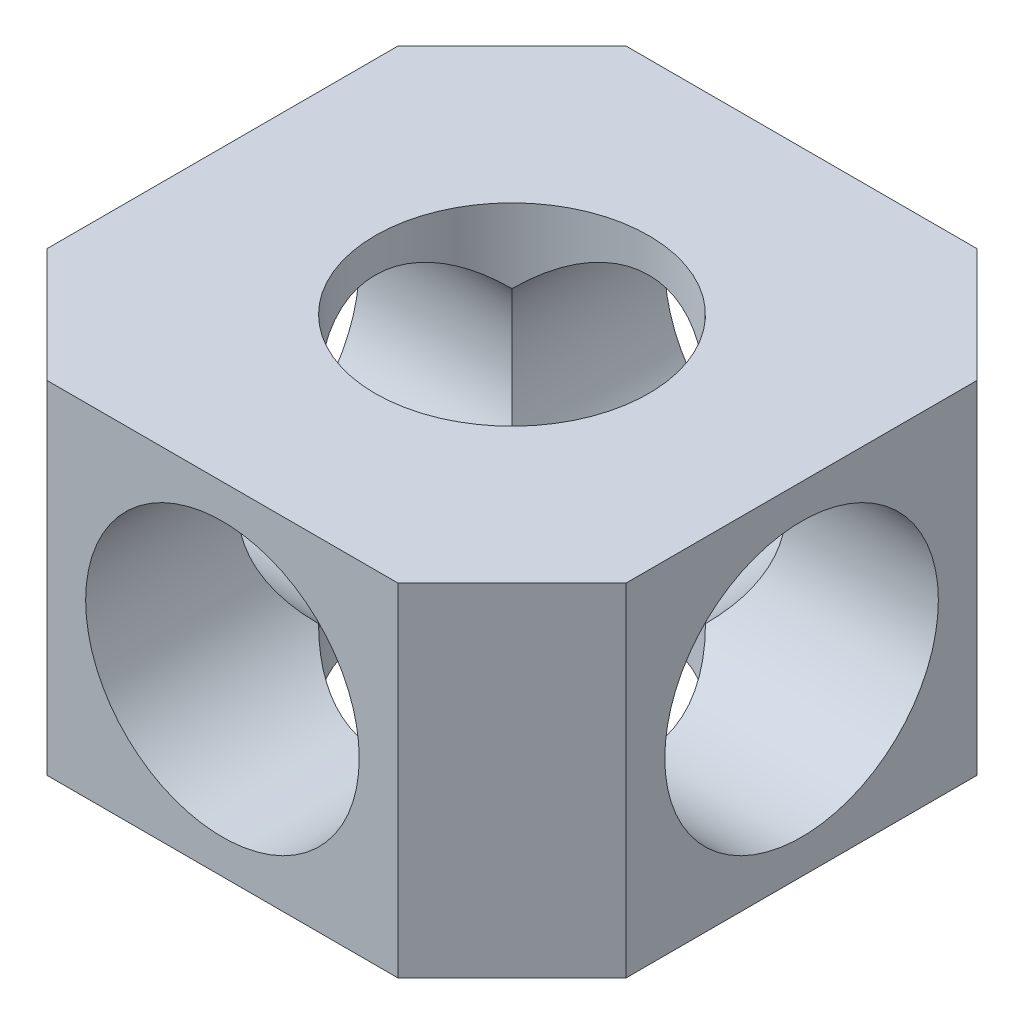
ISO-10303-21;
HEADER;
FILE_DESCRIPTION(('STEP AP214'),'2;1');
FILE_NAME('part.step','',(''),(''),'','','');
FILE_SCHEMA(('AUTOMOTIVE_DESIGN { 1 0 10303 214 1 1 1 1 }'));
ENDSEC;
DATA;
#1=APPLICATION_CONTEXT('core data for automotive mechanical design processes');
#2=APPLICATION_PROTOCOL_DEFINITION('international standard','automotive_design',2000,#1);
#3=PRODUCT_CONTEXT('',#1,'mechanical');
#4=PRODUCT('Part','Part','',(#3));
#5=PRODUCT_RELATED_PRODUCT_CATEGORY('part','',(#4));
#6=PRODUCT_DEFINITION_FORMATION('','',#4);
#7=PRODUCT_DEFINITION_CONTEXT('part definition',#1,'design');
#8=PRODUCT_DEFINITION('design','',#6,#7);
#9=PRODUCT_DEFINITION_SHAPE('','',#8);
#10=(LENGTH_UNIT() NAMED_UNIT(*) SI_UNIT(.MILLI.,.METRE.));
#11=(NAMED_UNIT(*) PLANE_ANGLE_UNIT() SI_UNIT($,.RADIAN.));
#12=(NAMED_UNIT(*) SI_UNIT($,.STERADIAN.) SOLID_ANGLE_UNIT());
#13=UNCERTAINTY_MEASURE_WITH_UNIT(LENGTH_MEASURE(1.E-05),#10,'distance_accuracy_value','');
#14=(GEOMETRIC_REPRESENTATION_CONTEXT(3) GLOBAL_UNCERTAINTY_ASSIGNED_CONTEXT((#13)) GLOBAL_UNIT_ASSIGNED_CONTEXT((#10,
#11,#12)) REPRESENTATION_CONTEXT('',''));
#15=CARTESIAN_POINT('',(0.,0.,0.));
#16=DIRECTION('',(0.,0.,1.));
#17=DIRECTION('',(1.,0.,0.));
#18=AXIS2_PLACEMENT_3D('',#15,#16,#17);
#19=CARTESIAN_POINT('',(0.,15.,0.));
#20=DIRECTION('',(0.,-1.,0.));
#21=DIRECTION('',(0.,0.,-1.));
#22=AXIS2_PLACEMENT_3D('',#19,#20,#21);
#23=CYLINDRICAL_SURFACE('',#22,6.);
#24=CARTESIAN_POINT('',(0.,0.,0.));
#25=DIRECTION('',(0.,1.,0.));
#26=DIRECTION('',(0.,0.,1.));
#27=AXIS2_PLACEMENT_3D('',#24,#25,#26);
#28=CIRCLE('',#27,6.);
#29=CARTESIAN_POINT('',(0.,0.,6.));
#30=VERTEX_POINT('',#29);
#31=EDGE_CURVE('E175',#30,#30,#28,.T.);
#32=ORIENTED_EDGE('',*,*,#31,.F.);
#33=EDGE_LOOP('',(#32));
#34=FACE_BOUND('',#33,.T.);
#35=CARTESIAN_POINT('',(0.,7.5,0.));
#36=DIRECTION('',(0.,-0.707106781186547,-0.707106781186547));
#37=DIRECTION('',(0.,-0.707106781186547,0.707106781186547));
#38=AXIS2_PLACEMENT_3D('',#35,#36,#37);
#39=ELLIPSE('',#38,8.48528137423857,6.);
#40=CARTESIAN_POINT('',(-4.24264068711928,3.25735931288072,4.24264068711928));
#41=VERTEX_POINT('',#40);
#42=CARTESIAN_POINT('',(4.24264068711928,3.25735931288072,4.24264068711928));
#43=VERTEX_POINT('',#42);
#44=EDGE_CURVE('E133',#41,#43,#39,.F.);
#45=ORIENTED_EDGE('',*,*,#44,.T.);
#46=CARTESIAN_POINT('',(0.,7.5,0.));
#47=DIRECTION('',(-0.707106781186547,-0.707106781186547,0.));
#48=DIRECTION('',(0.707106781186547,-0.707106781186547,0.));
#49=AXIS2_PLACEMENT_3D('',#46,#47,#48);
#50=ELLIPSE('',#49,8.48528137423857,6.);
#51=CARTESIAN_POINT('',(4.24264068711928,3.25735931288072,-4.24264068711928));
#52=VERTEX_POINT('',#51);
#53=EDGE_CURVE('E54',#43,#52,#50,.F.);
#54=ORIENTED_EDGE('',*,*,#53,.T.);
#55=CARTESIAN_POINT('',(0.,7.5,0.));
#56=DIRECTION('',(0.,-0.707106781186547,0.707106781186547));
#57=DIRECTION('',(0.,-0.707106781186547,-0.707106781186547));
#58=AXIS2_PLACEMENT_3D('',#55,#56,#57);
#59=ELLIPSE('',#58,8.48528137423857,6.);
#60=CARTESIAN_POINT('',(-4.24264068711928,3.25735931288072,-4.24264068711928));
#61=VERTEX_POINT('',#60);
#62=EDGE_CURVE('E143',#52,#61,#59,.F.);
#63=ORIENTED_EDGE('',*,*,#62,.T.);
#64=CARTESIAN_POINT('',(0.,7.5,0.));
#65=DIRECTION('',(0.707106781186547,-0.707106781186547,0.));
#66=DIRECTION('',(-0.707106781186547,-0.707106781186547,0.));
#67=AXIS2_PLACEMENT_3D('',#64,#65,#66);
#68=ELLIPSE('',#67,8.48528137423857,6.);
#69=EDGE_CURVE('E154',#61,#41,#68,.F.);
#70=ORIENTED_EDGE('',*,*,#69,.T.);
#71=EDGE_LOOP('',(#45,#54,#63,#70));
#72=FACE_BOUND('',#71,.T.);
#73=ADVANCED_FACE('F39',(#34,#72),#23,.F.);
#74=CARTESIAN_POINT('',(0.,15.,0.));
#75=DIRECTION('',(0.,1.,0.));
#76=DIRECTION('',(0.,0.,1.));
#77=AXIS2_PLACEMENT_3D('',#74,#75,#76);
#78=CIRCLE('',#77,6.);
#79=CARTESIAN_POINT('',(0.,15.,6.));
#80=VERTEX_POINT('',#79);
#81=EDGE_CURVE('E176',#80,#80,#78,.T.);
#82=ORIENTED_EDGE('',*,*,#81,.T.);
#83=EDGE_LOOP('',(#82));
#84=FACE_BOUND('',#83,.T.);
#85=CARTESIAN_POINT('',(0.,7.5,0.));
#86=DIRECTION('',(0.,-0.707106781186547,0.707106781186547));
#87=DIRECTION('',(0.,-0.707106781186547,-0.707106781186547));
#88=AXIS2_PLACEMENT_3D('',#85,#86,#87);
#89=ELLIPSE('',#88,8.48528137423857,6.);
#90=CARTESIAN_POINT('',(4.24264068711928,11.7426406871193,4.24264068711928));
#91=VERTEX_POINT('',#90);
#92=CARTESIAN_POINT('',(-4.24264068711928,11.7426406871193,4.24264068711928));
#93=VERTEX_POINT('',#92);
#94=EDGE_CURVE('E138',#91,#93,#89,.T.);
#95=ORIENTED_EDGE('',*,*,#94,.T.);
#96=CARTESIAN_POINT('',(0.,7.5,0.));
#97=DIRECTION('',(-0.707106781186547,-0.707106781186547,0.));
#98=DIRECTION('',(0.707106781186547,-0.707106781186547,0.));
#99=AXIS2_PLACEMENT_3D('',#96,#97,#98);
#100=ELLIPSE('',#99,8.48528137423857,6.);
#101=CARTESIAN_POINT('',(-4.24264068711928,11.7426406871193,-4.24264068711928));
#102=VERTEX_POINT('',#101);
#103=EDGE_CURVE('E62',#93,#102,#100,.T.);
#104=ORIENTED_EDGE('',*,*,#103,.T.);
#105=CARTESIAN_POINT('',(0.,7.5,0.));
#106=DIRECTION('',(0.,-0.707106781186547,-0.707106781186547));
#107=DIRECTION('',(0.,-0.707106781186547,0.707106781186547));
#108=AXIS2_PLACEMENT_3D('',#105,#106,#107);
#109=ELLIPSE('',#108,8.48528137423857,6.);
#110=CARTESIAN_POINT('',(4.24264068711928,11.7426406871193,-4.24264068711928));
#111=VERTEX_POINT('',#110);
#112=EDGE_CURVE('E140',#102,#111,#109,.T.);
#113=ORIENTED_EDGE('',*,*,#112,.T.);
#114=CARTESIAN_POINT('',(0.,7.5,0.));
#115=DIRECTION('',(0.707106781186547,-0.707106781186547,0.));
#116=DIRECTION('',(-0.707106781186547,-0.707106781186547,0.));
#117=AXIS2_PLACEMENT_3D('',#114,#115,#116);
#118=ELLIPSE('',#117,8.48528137423857,6.);
#119=EDGE_CURVE('E127',#111,#91,#118,.T.);
#120=ORIENTED_EDGE('',*,*,#119,.T.);
#121=EDGE_LOOP('',(#95,#104,#113,#120));
#122=FACE_BOUND('',#121,.T.);
#123=ADVANCED_FACE('F137',(#84,#122),#23,.F.);
#124=CARTESIAN_POINT('',(0.,7.5,15.));
#125=DIRECTION('',(0.,0.,-1.));
#126=DIRECTION('',(-1.,0.,0.));
#127=AXIS2_PLACEMENT_3D('',#124,#125,#126);
#128=CYLINDRICAL_SURFACE('',#127,6.);
#129=CARTESIAN_POINT('',(0.,7.5,-12.7));
#130=DIRECTION('',(0.,0.,1.));
#131=DIRECTION('',(1.,0.,0.));
#132=AXIS2_PLACEMENT_3D('',#129,#130,#131);
#133=CIRCLE('',#132,6.);
#134=CARTESIAN_POINT('',(6.,7.5,-12.7));
#135=VERTEX_POINT('',#134);
#136=EDGE_CURVE('E172',#135,#135,#133,.F.);
#137=ORIENTED_EDGE('',*,*,#136,.T.);
#138=EDGE_LOOP('',(#137));
#139=FACE_BOUND('',#138,.T.);
#140=ORIENTED_EDGE('',*,*,#62,.F.);
#141=CARTESIAN_POINT('',(0.,7.5,0.));
#142=DIRECTION('',(-0.707106781186547,0.,-0.707106781186547));
#143=DIRECTION('',(0.707106781186547,0.,-0.707106781186547));
#144=AXIS2_PLACEMENT_3D('',#141,#142,#143);
#145=ELLIPSE('',#144,8.48528137423857,6.);
#146=EDGE_CURVE('E160',#52,#111,#145,.F.);
#147=ORIENTED_EDGE('',*,*,#146,.T.);
#148=ORIENTED_EDGE('',*,*,#112,.F.);
#149=CARTESIAN_POINT('',(0.,7.5,0.));
#150=DIRECTION('',(0.707106781186547,0.,-0.707106781186547));
#151=DIRECTION('',(-0.707106781186547,0.,-0.707106781186547));
#152=AXIS2_PLACEMENT_3D('',#149,#150,#151);
#153=ELLIPSE('',#152,8.48528137423857,6.);
#154=EDGE_CURVE('E156',#102,#61,#153,.F.);
#155=ORIENTED_EDGE('',*,*,#154,.T.);
#156=EDGE_LOOP('',(#140,#147,#148,#155));
#157=FACE_BOUND('',#156,.T.);
#158=ADVANCED_FACE('F291',(#139,#157),#128,.F.);
#159=CARTESIAN_POINT('',(0.,7.5,12.7));
#160=DIRECTION('',(0.,0.,-1.));
#161=DIRECTION('',(-1.,0.,0.));
#162=AXIS2_PLACEMENT_3D('',#159,#160,#161);
#163=CIRCLE('',#162,6.);
#164=CARTESIAN_POINT('',(-6.,7.5,12.7));
#165=VERTEX_POINT('',#164);
#166=EDGE_CURVE('E169',#165,#165,#163,.F.);
#167=ORIENTED_EDGE('',*,*,#166,.T.);
#168=EDGE_LOOP('',(#167));
#169=FACE_BOUND('',#168,.T.);
#170=ORIENTED_EDGE('',*,*,#44,.F.);
#171=CARTESIAN_POINT('',(0.,7.5,0.));
#172=DIRECTION('',(-0.707106781186547,0.,-0.707106781186547));
#173=DIRECTION('',(0.707106781186547,0.,-0.707106781186547));
#174=AXIS2_PLACEMENT_3D('',#171,#172,#173);
#175=ELLIPSE('',#174,8.48528137423857,6.);
#176=EDGE_CURVE('E11',#41,#93,#175,.T.);
#177=ORIENTED_EDGE('',*,*,#176,.T.);
#178=ORIENTED_EDGE('',*,*,#94,.F.);
#179=CARTESIAN_POINT('',(0.,7.5,0.));
#180=DIRECTION('',(0.707106781186547,0.,-0.707106781186547));
#181=DIRECTION('',(-0.707106781186547,0.,-0.707106781186547));
#182=AXIS2_PLACEMENT_3D('',#179,#180,#181);
#183=ELLIPSE('',#182,8.48528137423857,6.);
#184=EDGE_CURVE('E47',#91,#43,#183,.T.);
#185=ORIENTED_EDGE('',*,*,#184,.T.);
#186=EDGE_LOOP('',(#170,#177,#178,#185));
#187=FACE_BOUND('',#186,.T.);
#188=ADVANCED_FACE('F142',(#169,#187),#128,.F.);
#189=CARTESIAN_POINT('',(12.7,15.,12.7));
#190=DIRECTION('',(-1.,0.,0.));
#191=DIRECTION('',(0.,0.,1.));
#192=AXIS2_PLACEMENT_3D('',#189,#190,#191);
#193=PLANE('',#192);
#194=CARTESIAN_POINT('',(12.7,7.5,0.));
#195=DIRECTION('',(-1.,0.,0.));
#196=DIRECTION('',(0.,0.,1.));
#197=AXIS2_PLACEMENT_3D('',#194,#195,#196);
#198=CIRCLE('',#197,6.);
#199=CARTESIAN_POINT('',(12.7,7.5,6.));
#200=VERTEX_POINT('',#199);
#201=EDGE_CURVE('E166',#200,#200,#198,.F.);
#202=ORIENTED_EDGE('',*,*,#201,.F.);
#203=EDGE_LOOP('',(#202));
#204=FACE_BOUND('',#203,.T.);
#205=DIRECTION('',(0.,-1.,0.));
#206=VECTOR('',#205,1.);
#207=CARTESIAN_POINT('',(12.6999999999999,15.,7.7));
#208=LINE('',#207,#206);
#209=CARTESIAN_POINT('',(12.6999999999999,15.,7.7));
#210=VERTEX_POINT('',#209);
#211=CARTESIAN_POINT('',(12.6999999999999,0.,7.7));
#212=VERTEX_POINT('',#211);
#213=EDGE_CURVE('E188',#210,#212,#208,.T.);
#214=ORIENTED_EDGE('',*,*,#213,.T.);
#215=DIRECTION('',(0.,0.,-1.));
#216=VECTOR('',#215,1.);
#217=CARTESIAN_POINT('',(12.7,0.,12.7));
#218=LINE('',#217,#216);
#219=CARTESIAN_POINT('',(12.7,0.,-7.7));
#220=VERTEX_POINT('',#219);
#221=EDGE_CURVE('E221',#212,#220,#218,.T.);
#222=ORIENTED_EDGE('',*,*,#221,.T.);
#223=DIRECTION('',(0.,-1.,0.));
#224=VECTOR('',#223,1.);
#225=CARTESIAN_POINT('',(12.6999999999999,15.,-7.7));
#226=LINE('',#225,#224);
#227=CARTESIAN_POINT('',(12.6999999999999,15.,-7.7));
#228=VERTEX_POINT('',#227);
#229=EDGE_CURVE('E184',#228,#220,#226,.T.);
#230=ORIENTED_EDGE('',*,*,#229,.F.);
#231=DIRECTION('',(0.,0.,-1.));
#232=VECTOR('',#231,1.);
#233=CARTESIAN_POINT('',(12.7,15.,12.7));
#234=LINE('',#233,#232);
#235=EDGE_CURVE('E222',#210,#228,#234,.T.);
#236=ORIENTED_EDGE('',*,*,#235,.F.);
#237=EDGE_LOOP('',(#214,#222,#230,#236));
#238=FACE_BOUND('',#237,.T.);
#239=ADVANCED_FACE('F41',(#204,#238),#193,.F.);
#240=CARTESIAN_POINT('',(-12.7,15.,-12.7));
#241=DIRECTION('',(0.,0.,1.));
#242=DIRECTION('',(1.,0.,0.));
#243=AXIS2_PLACEMENT_3D('',#240,#241,#242);
#244=PLANE('',#243);
#245=ORIENTED_EDGE('',*,*,#136,.F.);
#246=EDGE_LOOP('',(#245));
#247=FACE_BOUND('',#246,.T.);
#248=DIRECTION('',(0.,-1.,0.));
#249=VECTOR('',#248,1.);
#250=CARTESIAN_POINT('',(7.69999999999992,15.,-12.7));
#251=LINE('',#250,#249);
#252=CARTESIAN_POINT('',(7.69999999999992,15.,-12.7));
#253=VERTEX_POINT('',#252);
#254=CARTESIAN_POINT('',(7.69999999999992,0.,-12.7));
#255=VERTEX_POINT('',#254);
#256=EDGE_CURVE('E190',#253,#255,#251,.T.);
#257=ORIENTED_EDGE('',*,*,#256,.T.);
#258=DIRECTION('',(-1.,0.,0.));
#259=VECTOR('',#258,1.);
#260=CARTESIAN_POINT('',(-12.7,0.,-12.7));
#261=LINE('',#260,#259);
#262=CARTESIAN_POINT('',(-7.7,0.,-12.7));
#263=VERTEX_POINT('',#262);
#264=EDGE_CURVE('E236',#255,#263,#261,.T.);
#265=ORIENTED_EDGE('',*,*,#264,.T.);
#266=DIRECTION('',(0.,-1.,0.));
#267=VECTOR('',#266,1.);
#268=CARTESIAN_POINT('',(-7.7,15.,-12.7));
#269=LINE('',#268,#267);
#270=CARTESIAN_POINT('',(-7.7,15.,-12.7));
#271=VERTEX_POINT('',#270);
#272=EDGE_CURVE('E214',#271,#263,#269,.T.);
#273=ORIENTED_EDGE('',*,*,#272,.F.);
#274=DIRECTION('',(-1.,0.,0.));
#275=VECTOR('',#274,1.);
#276=CARTESIAN_POINT('',(-12.7,15.,-12.7));
#277=LINE('',#276,#275);
#278=EDGE_CURVE('E225',#253,#271,#277,.T.);
#279=ORIENTED_EDGE('',*,*,#278,.F.);
#280=EDGE_LOOP('',(#257,#265,#273,#279));
#281=FACE_BOUND('',#280,.T.);
#282=ADVANCED_FACE('F273',(#247,#281),#244,.F.);
#283=CARTESIAN_POINT('',(-12.7,15.,12.7));
#284=DIRECTION('',(1.,0.,0.));
#285=DIRECTION('',(0.,0.,-1.));
#286=AXIS2_PLACEMENT_3D('',#283,#284,#285);
#287=PLANE('',#286);
#288=CARTESIAN_POINT('',(-12.7,7.5,0.));
#289=DIRECTION('',(1.,0.,0.));
#290=DIRECTION('',(0.,0.,-1.));
#291=AXIS2_PLACEMENT_3D('',#288,#289,#290);
#292=CIRCLE('',#291,6.);
#293=CARTESIAN_POINT('',(-12.7,7.5,-6.));
#294=VERTEX_POINT('',#293);
#295=EDGE_CURVE('E158',#294,#294,#292,.F.);
#296=ORIENTED_EDGE('',*,*,#295,.F.);
#297=EDGE_LOOP('',(#296));
#298=FACE_BOUND('',#297,.T.);
#299=DIRECTION('',(0.,-1.,0.));
#300=VECTOR('',#299,1.);
#301=CARTESIAN_POINT('',(-12.7,15.,7.7));
#302=LINE('',#301,#300);
#303=CARTESIAN_POINT('',(-12.7,15.,7.7));
#304=VERTEX_POINT('',#303);
#305=CARTESIAN_POINT('',(-12.7,0.,7.7));
#306=VERTEX_POINT('',#305);
#307=EDGE_CURVE('E206',#304,#306,#302,.T.);
#308=ORIENTED_EDGE('',*,*,#307,.F.);
#309=DIRECTION('',(0.,0.,1.));
#310=VECTOR('',#309,1.);
#311=CARTESIAN_POINT('',(-12.7,15.,12.7));
#312=LINE('',#311,#310);
#313=CARTESIAN_POINT('',(-12.7,15.,-7.7));
#314=VERTEX_POINT('',#313);
#315=EDGE_CURVE('E229',#314,#304,#312,.T.);
#316=ORIENTED_EDGE('',*,*,#315,.F.);
#317=DIRECTION('',(0.,-1.,0.));
#318=VECTOR('',#317,1.);
#319=CARTESIAN_POINT('',(-12.7,15.,-7.7));
#320=LINE('',#319,#318);
#321=CARTESIAN_POINT('',(-12.7,0.,-7.7));
#322=VERTEX_POINT('',#321);
#323=EDGE_CURVE('E218',#314,#322,#320,.T.);
#324=ORIENTED_EDGE('',*,*,#323,.T.);
#325=DIRECTION('',(0.,0.,1.));
#326=VECTOR('',#325,1.);
#327=CARTESIAN_POINT('',(-12.7,0.,12.7));
#328=LINE('',#327,#326);
#329=EDGE_CURVE('E239',#322,#306,#328,.T.);
#330=ORIENTED_EDGE('',*,*,#329,.T.);
#331=EDGE_LOOP('',(#308,#316,#324,#330));
#332=FACE_BOUND('',#331,.T.);
#333=ADVANCED_FACE('F268',(#298,#332),#287,.F.);
#334=CARTESIAN_POINT('',(-12.7,15.,12.7));
#335=DIRECTION('',(0.,0.,-1.));
#336=DIRECTION('',(-1.,0.,0.));
#337=AXIS2_PLACEMENT_3D('',#334,#335,#336);
#338=PLANE('',#337);
#339=ORIENTED_EDGE('',*,*,#166,.F.);
#340=EDGE_LOOP('',(#339));
#341=FACE_BOUND('',#340,.T.);
#342=DIRECTION('',(0.,-1.,0.));
#343=VECTOR('',#342,1.);
#344=CARTESIAN_POINT('',(-7.7,15.,12.7));
#345=LINE('',#344,#343);
#346=CARTESIAN_POINT('',(-7.7,15.,12.7));
#347=VERTEX_POINT('',#346);
#348=CARTESIAN_POINT('',(-7.7,0.,12.7));
#349=VERTEX_POINT('',#348);
#350=EDGE_CURVE('E200',#347,#349,#345,.T.);
#351=ORIENTED_EDGE('',*,*,#350,.T.);
#352=DIRECTION('',(1.,0.,0.));
#353=VECTOR('',#352,1.);
#354=CARTESIAN_POINT('',(-12.7,0.,12.7));
#355=LINE('',#354,#353);
#356=CARTESIAN_POINT('',(7.69999999999992,0.,12.7));
#357=VERTEX_POINT('',#356);
#358=EDGE_CURVE('E226',#349,#357,#355,.T.);
#359=ORIENTED_EDGE('',*,*,#358,.T.);
#360=DIRECTION('',(0.,-1.,0.));
#361=VECTOR('',#360,1.);
#362=CARTESIAN_POINT('',(7.69999999999992,15.,12.7));
#363=LINE('',#362,#361);
#364=CARTESIAN_POINT('',(7.69999999999992,15.,12.7));
#365=VERTEX_POINT('',#364);
#366=EDGE_CURVE('E196',#365,#357,#363,.T.);
#367=ORIENTED_EDGE('',*,*,#366,.F.);
#368=DIRECTION('',(1.,0.,0.));
#369=VECTOR('',#368,1.);
#370=CARTESIAN_POINT('',(-12.7,15.,12.7));
#371=LINE('',#370,#369);
#372=EDGE_CURVE('E147',#347,#365,#371,.T.);
#373=ORIENTED_EDGE('',*,*,#372,.F.);
#374=EDGE_LOOP('',(#351,#359,#367,#373));
#375=FACE_BOUND('',#374,.T.);
#376=ADVANCED_FACE('F245',(#341,#375),#338,.F.);
#377=CARTESIAN_POINT('',(0.,15.,0.));
#378=DIRECTION('',(0.,-1.,0.));
#379=DIRECTION('',(0.,0.,-1.));
#380=AXIS2_PLACEMENT_3D('',#377,#378,#379);
#381=PLANE('',#380);
#382=ORIENTED_EDGE('',*,*,#81,.F.);
#383=EDGE_LOOP('',(#382));
#384=FACE_BOUND('',#383,.T.);
#385=DIRECTION('',(-0.707106781186548,0.,-0.707106781186548));
#386=VECTOR('',#385,1.);
#387=CARTESIAN_POINT('',(-12.7,15.,7.7));
#388=LINE('',#387,#386);
#389=EDGE_CURVE('E204',#347,#304,#388,.T.);
#390=ORIENTED_EDGE('',*,*,#389,.F.);
#391=ORIENTED_EDGE('',*,*,#372,.T.);
#392=DIRECTION('',(-0.70710678118655,0.,0.707106781186545));
#393=VECTOR('',#392,1.);
#394=CARTESIAN_POINT('',(12.6999999999999,15.,7.7));
#395=LINE('',#394,#393);
#396=EDGE_CURVE('E194',#210,#365,#395,.T.);
#397=ORIENTED_EDGE('',*,*,#396,.F.);
#398=ORIENTED_EDGE('',*,*,#235,.T.);
#399=DIRECTION('',(0.70710678118655,0.,0.707106781186545));
#400=VECTOR('',#399,1.);
#401=CARTESIAN_POINT('',(12.6999999999999,15.,-7.7));
#402=LINE('',#401,#400);
#403=EDGE_CURVE('E182',#253,#228,#402,.T.);
#404=ORIENTED_EDGE('',*,*,#403,.F.);
#405=ORIENTED_EDGE('',*,*,#278,.T.);
#406=DIRECTION('',(0.707106781186548,0.,-0.707106781186548));
#407=VECTOR('',#406,1.);
#408=CARTESIAN_POINT('',(-12.7,15.,-7.7));
#409=LINE('',#408,#407);
#410=EDGE_CURVE('E212',#314,#271,#409,.T.);
#411=ORIENTED_EDGE('',*,*,#410,.F.);
#412=ORIENTED_EDGE('',*,*,#315,.T.);
#413=EDGE_LOOP('',(#390,#391,#397,#398,#404,#405,#411,#412));
#414=FACE_BOUND('',#413,.T.);
#415=ADVANCED_FACE('F260',(#384,#414),#381,.F.);
#416=CARTESIAN_POINT('',(0.,0.,0.));
#417=DIRECTION('',(0.,-1.,0.));
#418=DIRECTION('',(0.,0.,-1.));
#419=AXIS2_PLACEMENT_3D('',#416,#417,#418);
#420=PLANE('',#419);
#421=ORIENTED_EDGE('',*,*,#31,.T.);
#422=EDGE_LOOP('',(#421));
#423=FACE_BOUND('',#422,.T.);
#424=ORIENTED_EDGE('',*,*,#358,.F.);
#425=DIRECTION('',(-0.707106781186548,0.,-0.707106781186548));
#426=VECTOR('',#425,1.);
#427=CARTESIAN_POINT('',(-12.7,0.,7.7));
#428=LINE('',#427,#426);
#429=EDGE_CURVE('E179',#349,#306,#428,.T.);
#430=ORIENTED_EDGE('',*,*,#429,.T.);
#431=ORIENTED_EDGE('',*,*,#329,.F.);
#432=DIRECTION('',(0.707106781186548,0.,-0.707106781186548));
#433=VECTOR('',#432,1.);
#434=CARTESIAN_POINT('',(-12.7,0.,-7.7));
#435=LINE('',#434,#433);
#436=EDGE_CURVE('E193',#322,#263,#435,.T.);
#437=ORIENTED_EDGE('',*,*,#436,.T.);
#438=ORIENTED_EDGE('',*,*,#264,.F.);
#439=DIRECTION('',(0.70710678118655,0.,0.707106781186545));
#440=VECTOR('',#439,1.);
#441=CARTESIAN_POINT('',(12.6999999999999,0.,-7.7));
#442=LINE('',#441,#440);
#443=EDGE_CURVE('E185',#255,#220,#442,.T.);
#444=ORIENTED_EDGE('',*,*,#443,.T.);
#445=ORIENTED_EDGE('',*,*,#221,.F.);
#446=DIRECTION('',(-0.70710678118655,0.,0.707106781186545));
#447=VECTOR('',#446,1.);
#448=CARTESIAN_POINT('',(12.6999999999999,0.,7.7));
#449=LINE('',#448,#447);
#450=EDGE_CURVE('E197',#212,#357,#449,.T.);
#451=ORIENTED_EDGE('',*,*,#450,.T.);
#452=EDGE_LOOP('',(#424,#430,#431,#437,#438,#444,#445,#451));
#453=FACE_BOUND('',#452,.T.);
#454=ADVANCED_FACE('F248',(#423,#453),#420,.T.);
#455=CARTESIAN_POINT('',(-12.7,15.,-7.7));
#456=DIRECTION('',(-0.707106781186547,0.,-0.707106781186547));
#457=DIRECTION('',(-0.707106781186548,0.,0.707106781186548));
#458=AXIS2_PLACEMENT_3D('',#455,#456,#457);
#459=PLANE('',#458);
#460=ORIENTED_EDGE('',*,*,#436,.F.);
#461=ORIENTED_EDGE('',*,*,#323,.F.);
#462=ORIENTED_EDGE('',*,*,#410,.T.);
#463=ORIENTED_EDGE('',*,*,#272,.T.);
#464=EDGE_LOOP('',(#460,#461,#462,#463));
#465=FACE_BOUND('',#464,.T.);
#466=ADVANCED_FACE('F277',(#465),#459,.T.);
#467=CARTESIAN_POINT('',(12.6999999999999,15.,-7.7));
#468=DIRECTION('',(0.707106781186545,0.,-0.70710678118655));
#469=DIRECTION('',(-0.70710678118655,0.,-0.707106781186545));
#470=AXIS2_PLACEMENT_3D('',#467,#468,#469);
#471=PLANE('',#470);
#472=ORIENTED_EDGE('',*,*,#443,.F.);
#473=ORIENTED_EDGE('',*,*,#256,.F.);
#474=ORIENTED_EDGE('',*,*,#403,.T.);
#475=ORIENTED_EDGE('',*,*,#229,.T.);
#476=EDGE_LOOP('',(#472,#473,#474,#475));
#477=FACE_BOUND('',#476,.T.);
#478=ADVANCED_FACE('F275',(#477),#471,.T.);
#479=CARTESIAN_POINT('',(12.6999999999999,15.,7.7));
#480=DIRECTION('',(0.707106781186545,0.,0.70710678118655));
#481=DIRECTION('',(0.70710678118655,0.,-0.707106781186545));
#482=AXIS2_PLACEMENT_3D('',#479,#480,#481);
#483=PLANE('',#482);
#484=ORIENTED_EDGE('',*,*,#450,.F.);
#485=ORIENTED_EDGE('',*,*,#213,.F.);
#486=ORIENTED_EDGE('',*,*,#396,.T.);
#487=ORIENTED_EDGE('',*,*,#366,.T.);
#488=EDGE_LOOP('',(#484,#485,#486,#487));
#489=FACE_BOUND('',#488,.T.);
#490=ADVANCED_FACE('F252',(#489),#483,.T.);
#491=CARTESIAN_POINT('',(-12.7,15.,7.7));
#492=DIRECTION('',(-0.707106781186547,0.,0.707106781186547));
#493=DIRECTION('',(0.707106781186548,0.,0.707106781186548));
#494=AXIS2_PLACEMENT_3D('',#491,#492,#493);
#495=PLANE('',#494);
#496=ORIENTED_EDGE('',*,*,#429,.F.);
#497=ORIENTED_EDGE('',*,*,#350,.F.);
#498=ORIENTED_EDGE('',*,*,#389,.T.);
#499=ORIENTED_EDGE('',*,*,#307,.T.);
#500=EDGE_LOOP('',(#496,#497,#498,#499));
#501=FACE_BOUND('',#500,.T.);
#502=ADVANCED_FACE('F266',(#501),#495,.T.);
#503=CARTESIAN_POINT('',(15.,7.5,0.));
#504=DIRECTION('',(-1.,0.,0.));
#505=DIRECTION('',(0.,0.,1.));
#506=AXIS2_PLACEMENT_3D('',#503,#504,#505);
#507=CYLINDRICAL_SURFACE('',#506,6.);
#508=ORIENTED_EDGE('',*,*,#53,.F.);
#509=ORIENTED_EDGE('',*,*,#184,.F.);
#510=ORIENTED_EDGE('',*,*,#119,.F.);
#511=ORIENTED_EDGE('',*,*,#146,.F.);
#512=EDGE_LOOP('',(#508,#509,#510,#511));
#513=FACE_BOUND('',#512,.T.);
#514=ORIENTED_EDGE('',*,*,#201,.T.);
#515=EDGE_LOOP('',(#514));
#516=FACE_BOUND('',#515,.T.);
#517=ADVANCED_FACE('F125',(#513,#516),#507,.F.);
#518=ORIENTED_EDGE('',*,*,#103,.F.);
#519=ORIENTED_EDGE('',*,*,#176,.F.);
#520=ORIENTED_EDGE('',*,*,#69,.F.);
#521=ORIENTED_EDGE('',*,*,#154,.F.);
#522=EDGE_LOOP('',(#518,#519,#520,#521));
#523=FACE_BOUND('',#522,.T.);
#524=ORIENTED_EDGE('',*,*,#295,.T.);
#525=EDGE_LOOP('',(#524));
#526=FACE_BOUND('',#525,.T.);
#527=ADVANCED_FACE('F299',(#523,#526),#507,.F.);
#528=CLOSED_SHELL('',(#73,#123,#158,#188,#239,#282,#333,#376,#415,#454,#466,#478,#490,#502,#517,#527));
#529=MANIFOLD_SOLID_BREP('B2',#528);
#530=ADVANCED_BREP_SHAPE_REPRESENTATION('',(#18,#529),#14);
#531=SHAPE_DEFINITION_REPRESENTATION(#9,#530);
ENDSEC;
END-ISO-10303-21;
